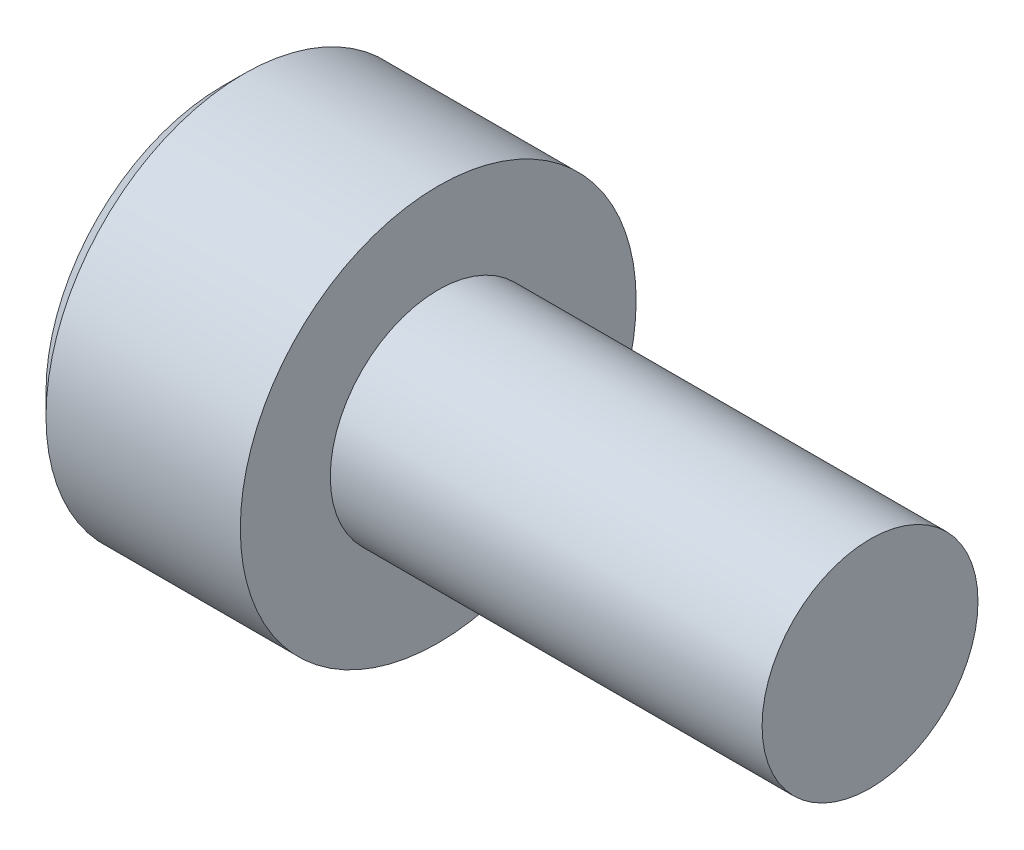
ISO-10303-21;
HEADER;
FILE_DESCRIPTION(('STEP AP214'),'2;1');
FILE_NAME('part.step','',(''),(''),'','','');
FILE_SCHEMA(('AUTOMOTIVE_DESIGN { 1 0 10303 214 1 1 1 1 }'));
ENDSEC;
DATA;
#1=APPLICATION_CONTEXT('core data for automotive mechanical design processes');
#2=APPLICATION_PROTOCOL_DEFINITION('international standard','automotive_design',2000,#1);
#3=PRODUCT_CONTEXT('',#1,'mechanical');
#4=PRODUCT('Part','Part','',(#3));
#5=PRODUCT_RELATED_PRODUCT_CATEGORY('part','',(#4));
#6=PRODUCT_DEFINITION_FORMATION('','',#4);
#7=PRODUCT_DEFINITION_CONTEXT('part definition',#1,'design');
#8=PRODUCT_DEFINITION('design','',#6,#7);
#9=PRODUCT_DEFINITION_SHAPE('','',#8);
#10=(LENGTH_UNIT() NAMED_UNIT(*) SI_UNIT(.MILLI.,.METRE.));
#11=(NAMED_UNIT(*) PLANE_ANGLE_UNIT() SI_UNIT($,.RADIAN.));
#12=(NAMED_UNIT(*) SI_UNIT($,.STERADIAN.) SOLID_ANGLE_UNIT());
#13=UNCERTAINTY_MEASURE_WITH_UNIT(LENGTH_MEASURE(1.E-05),#10,'distance_accuracy_value','');
#14=(GEOMETRIC_REPRESENTATION_CONTEXT(3) GLOBAL_UNCERTAINTY_ASSIGNED_CONTEXT((#13)) GLOBAL_UNIT_ASSIGNED_CONTEXT((#10,
#11,#12)) REPRESENTATION_CONTEXT('',''));
#15=CARTESIAN_POINT('',(0.,0.,0.));
#16=DIRECTION('',(0.,0.,1.));
#17=DIRECTION('',(1.,0.,0.));
#18=AXIS2_PLACEMENT_3D('',#15,#16,#17);
#19=CARTESIAN_POINT('',(-3.,0.,0.));
#20=DIRECTION('',(1.,0.,0.));
#21=DIRECTION('',(0.,1.,0.));
#22=AXIS2_PLACEMENT_3D('',#19,#20,#21);
#23=PLANE('',#22);
#24=CARTESIAN_POINT('',(-3.,0.,0.));
#25=DIRECTION('',(1.,0.,0.));
#26=DIRECTION('',(0.,1.,0.));
#27=AXIS2_PLACEMENT_3D('',#24,#25,#26);
#28=CIRCLE('',#27,2.45);
#29=CARTESIAN_POINT('',(-3.,2.45,0.));
#30=VERTEX_POINT('',#29);
#31=EDGE_CURVE('E44',#30,#30,#28,.F.);
#32=ORIENTED_EDGE('',*,*,#31,.T.);
#33=EDGE_LOOP('',(#32));
#34=FACE_BOUND('',#33,.T.);
#35=DIRECTION('',(0.,0.5,-0.866025403784439));
#36=VECTOR('',#35,1.);
#37=CARTESIAN_POINT('',(-3.,0.721687836487032,1.25));
#38=LINE('',#37,#36);
#39=CARTESIAN_POINT('',(-3.,0.721687836487031,1.25));
#40=VERTEX_POINT('',#39);
#41=CARTESIAN_POINT('',(-3.,1.44337567297406,0.));
#42=VERTEX_POINT('',#41);
#43=EDGE_CURVE('E149',#40,#42,#38,.T.);
#44=ORIENTED_EDGE('',*,*,#43,.F.);
#45=DIRECTION('',(0.,1.,0.));
#46=VECTOR('',#45,1.);
#47=CARTESIAN_POINT('',(-3.,-0.721687836487034,1.25));
#48=LINE('',#47,#46);
#49=CARTESIAN_POINT('',(-3.,-0.721687836487034,1.25));
#50=VERTEX_POINT('',#49);
#51=EDGE_CURVE('E122',#50,#40,#48,.T.);
#52=ORIENTED_EDGE('',*,*,#51,.F.);
#53=DIRECTION('',(0.,0.5,0.866025403784439));
#54=VECTOR('',#53,1.);
#55=CARTESIAN_POINT('',(-3.,-1.44337567297407,0.));
#56=LINE('',#55,#54);
#57=CARTESIAN_POINT('',(-3.,-1.44337567297407,0.));
#58=VERTEX_POINT('',#57);
#59=EDGE_CURVE('E118',#58,#50,#56,.T.);
#60=ORIENTED_EDGE('',*,*,#59,.F.);
#61=DIRECTION('',(0.,-0.5,0.866025403784439));
#62=VECTOR('',#61,1.);
#63=CARTESIAN_POINT('',(-3.,-0.721687836487033,-1.25));
#64=LINE('',#63,#62);
#65=CARTESIAN_POINT('',(-3.,-0.721687836487033,-1.25));
#66=VERTEX_POINT('',#65);
#67=EDGE_CURVE('E155',#66,#58,#64,.T.);
#68=ORIENTED_EDGE('',*,*,#67,.F.);
#69=DIRECTION('',(0.,-1.,0.));
#70=VECTOR('',#69,1.);
#71=CARTESIAN_POINT('',(-3.,0.721687836487032,-1.25));
#72=LINE('',#71,#70);
#73=CARTESIAN_POINT('',(-3.,0.721687836487032,-1.25));
#74=VERTEX_POINT('',#73);
#75=EDGE_CURVE('E153',#74,#66,#72,.T.);
#76=ORIENTED_EDGE('',*,*,#75,.F.);
#77=DIRECTION('',(0.,-0.5,-0.866025403784439));
#78=VECTOR('',#77,1.);
#79=CARTESIAN_POINT('',(-3.,1.44337567297406,0.));
#80=LINE('',#79,#78);
#81=EDGE_CURVE('E151',#42,#74,#80,.T.);
#82=ORIENTED_EDGE('',*,*,#81,.F.);
#83=EDGE_LOOP('',(#44,#52,#60,#68,#76,#82));
#84=FACE_BOUND('',#83,.T.);
#85=ADVANCED_FACE('F36',(#34,#84),#23,.F.);
#86=CARTESIAN_POINT('',(0.,1.5,0.));
#87=DIRECTION('',(-1.,0.,0.));
#88=DIRECTION('',(0.,-1.,0.));
#89=AXIS2_PLACEMENT_3D('',#86,#87,#88);
#90=PLANE('',#89);
#91=CARTESIAN_POINT('',(0.,0.,0.));
#92=DIRECTION('',(-1.,0.,0.));
#93=DIRECTION('',(0.,-1.,0.));
#94=AXIS2_PLACEMENT_3D('',#91,#92,#93);
#95=CIRCLE('',#94,2.75);
#96=CARTESIAN_POINT('',(0.,-2.75,0.));
#97=VERTEX_POINT('',#96);
#98=EDGE_CURVE('E181',#97,#97,#95,.T.);
#99=ORIENTED_EDGE('',*,*,#98,.F.);
#100=EDGE_LOOP('',(#99));
#101=FACE_BOUND('',#100,.T.);
#102=CARTESIAN_POINT('',(0.,0.,0.));
#103=DIRECTION('',(-1.,0.,0.));
#104=DIRECTION('',(0.,-1.,0.));
#105=AXIS2_PLACEMENT_3D('',#102,#103,#104);
#106=CIRCLE('',#105,1.5);
#107=CARTESIAN_POINT('',(0.,-1.5,0.));
#108=VERTEX_POINT('',#107);
#109=EDGE_CURVE('E175',#108,#108,#106,.T.);
#110=ORIENTED_EDGE('',*,*,#109,.T.);
#111=EDGE_LOOP('',(#110));
#112=FACE_BOUND('',#111,.T.);
#113=ADVANCED_FACE('F199',(#101,#112),#90,.F.);
#114=CARTESIAN_POINT('',(-3.,0.,0.));
#115=DIRECTION('',(-1.,0.,0.));
#116=DIRECTION('',(0.,-1.,0.));
#117=AXIS2_PLACEMENT_3D('',#114,#115,#116);
#118=CYLINDRICAL_SURFACE('',#117,2.75);
#119=CARTESIAN_POINT('',(-2.7,0.,0.));
#120=DIRECTION('',(1.,0.,0.));
#121=DIRECTION('',(0.,1.,0.));
#122=AXIS2_PLACEMENT_3D('',#119,#120,#121);
#123=CIRCLE('',#122,2.75);
#124=CARTESIAN_POINT('',(-2.7,2.75,0.));
#125=VERTEX_POINT('',#124);
#126=EDGE_CURVE('E11',#125,#125,#123,.T.);
#127=ORIENTED_EDGE('',*,*,#126,.T.);
#128=EDGE_LOOP('',(#127));
#129=FACE_BOUND('',#128,.T.);
#130=ORIENTED_EDGE('',*,*,#98,.T.);
#131=EDGE_LOOP('',(#130));
#132=FACE_BOUND('',#131,.T.);
#133=ADVANCED_FACE('F204',(#129,#132),#118,.T.);
#134=CARTESIAN_POINT('',(6.,1.5,0.));
#135=DIRECTION('',(-1.,0.,0.));
#136=DIRECTION('',(0.,-1.,0.));
#137=AXIS2_PLACEMENT_3D('',#134,#135,#136);
#138=PLANE('',#137);
#139=CARTESIAN_POINT('',(6.,0.,0.));
#140=DIRECTION('',(-1.,0.,0.));
#141=DIRECTION('',(0.,-1.,0.));
#142=AXIS2_PLACEMENT_3D('',#139,#140,#141);
#143=CIRCLE('',#142,1.5);
#144=CARTESIAN_POINT('',(6.,-1.5,0.));
#145=VERTEX_POINT('',#144);
#146=EDGE_CURVE('E178',#145,#145,#143,.T.);
#147=ORIENTED_EDGE('',*,*,#146,.F.);
#148=EDGE_LOOP('',(#147));
#149=FACE_BOUND('',#148,.T.);
#150=ADVANCED_FACE('F208',(#149),#138,.F.);
#151=CARTESIAN_POINT('',(-3.,0.,0.));
#152=DIRECTION('',(-1.,0.,0.));
#153=DIRECTION('',(0.,-1.,0.));
#154=AXIS2_PLACEMENT_3D('',#151,#152,#153);
#155=CYLINDRICAL_SURFACE('',#154,1.5);
#156=ORIENTED_EDGE('',*,*,#109,.F.);
#157=EDGE_LOOP('',(#156));
#158=FACE_BOUND('',#157,.T.);
#159=ORIENTED_EDGE('',*,*,#146,.T.);
#160=EDGE_LOOP('',(#159));
#161=FACE_BOUND('',#160,.T.);
#162=ADVANCED_FACE('F215',(#158,#161),#155,.T.);
#163=CARTESIAN_POINT('',(-1.7,-0.721687836487034,1.25));
#164=DIRECTION('',(0.,0.,1.));
#165=DIRECTION('',(0.,-1.,0.));
#166=AXIS2_PLACEMENT_3D('',#163,#164,#165);
#167=PLANE('',#166);
#168=DIRECTION('',(0.,1.,0.));
#169=VECTOR('',#168,1.);
#170=CARTESIAN_POINT('',(-1.7,-0.721687836487034,1.25));
#171=LINE('',#170,#169);
#172=CARTESIAN_POINT('',(-1.7,-0.721687836487034,1.25));
#173=VERTEX_POINT('',#172);
#174=CARTESIAN_POINT('',(-1.7,0.,1.25));
#175=VERTEX_POINT('',#174);
#176=EDGE_CURVE('E59',#173,#175,#171,.T.);
#177=ORIENTED_EDGE('',*,*,#176,.F.);
#178=DIRECTION('',(-1.,0.,0.));
#179=VECTOR('',#178,1.);
#180=CARTESIAN_POINT('',(-1.7,-0.721687836487034,1.25));
#181=LINE('',#180,#179);
#182=EDGE_CURVE('E159',#173,#50,#181,.T.);
#183=ORIENTED_EDGE('',*,*,#182,.T.);
#184=ORIENTED_EDGE('',*,*,#51,.T.);
#185=DIRECTION('',(-1.,0.,0.));
#186=VECTOR('',#185,1.);
#187=CARTESIAN_POINT('',(-1.7,0.721687836487032,1.25));
#188=LINE('',#187,#186);
#189=CARTESIAN_POINT('',(-1.7,0.721687836487032,1.25));
#190=VERTEX_POINT('',#189);
#191=EDGE_CURVE('E51',#190,#40,#188,.T.);
#192=ORIENTED_EDGE('',*,*,#191,.F.);
#193=EDGE_CURVE('E111',#175,#190,#171,.T.);
#194=ORIENTED_EDGE('',*,*,#193,.F.);
#195=EDGE_LOOP('',(#177,#183,#184,#192,#194));
#196=FACE_BOUND('',#195,.T.);
#197=ADVANCED_FACE('F120',(#196),#167,.F.);
#198=CARTESIAN_POINT('',(-1.7,-1.44337567297407,0.));
#199=DIRECTION('',(0.,-0.866025403784439,0.5));
#200=DIRECTION('',(0.,-0.5,-0.866025403784439));
#201=AXIS2_PLACEMENT_3D('',#198,#199,#200);
#202=PLANE('',#201);
#203=DIRECTION('',(0.,0.5,0.866025403784439));
#204=VECTOR('',#203,1.);
#205=CARTESIAN_POINT('',(-1.7,-1.44337567297407,0.));
#206=LINE('',#205,#204);
#207=CARTESIAN_POINT('',(-1.7,-1.44337567297407,0.));
#208=VERTEX_POINT('',#207);
#209=CARTESIAN_POINT('',(-1.7,-1.08253175473055,0.625000000000001));
#210=VERTEX_POINT('',#209);
#211=EDGE_CURVE('E125',#208,#210,#206,.T.);
#212=ORIENTED_EDGE('',*,*,#211,.F.);
#213=DIRECTION('',(-1.,0.,0.));
#214=VECTOR('',#213,1.);
#215=CARTESIAN_POINT('',(-1.7,-1.44337567297407,0.));
#216=LINE('',#215,#214);
#217=EDGE_CURVE('E162',#208,#58,#216,.T.);
#218=ORIENTED_EDGE('',*,*,#217,.T.);
#219=ORIENTED_EDGE('',*,*,#59,.T.);
#220=ORIENTED_EDGE('',*,*,#182,.F.);
#221=EDGE_CURVE('E145',#210,#173,#206,.T.);
#222=ORIENTED_EDGE('',*,*,#221,.F.);
#223=EDGE_LOOP('',(#212,#218,#219,#220,#222));
#224=FACE_BOUND('',#223,.T.);
#225=ADVANCED_FACE('F228',(#224),#202,.F.);
#226=CARTESIAN_POINT('',(-1.7,-0.721687836487033,-1.25));
#227=DIRECTION('',(0.,-0.866025403784439,-0.5));
#228=DIRECTION('',(0.,0.5,-0.866025403784439));
#229=AXIS2_PLACEMENT_3D('',#226,#227,#228);
#230=PLANE('',#229);
#231=DIRECTION('',(0.,-0.5,0.866025403784439));
#232=VECTOR('',#231,1.);
#233=CARTESIAN_POINT('',(-1.7,-0.721687836487033,-1.25));
#234=LINE('',#233,#232);
#235=CARTESIAN_POINT('',(-1.7,-0.721687836487033,-1.25));
#236=VERTEX_POINT('',#235);
#237=CARTESIAN_POINT('',(-1.7,-1.08253175473055,-0.625));
#238=VERTEX_POINT('',#237);
#239=EDGE_CURVE('E142',#236,#238,#234,.T.);
#240=ORIENTED_EDGE('',*,*,#239,.F.);
#241=DIRECTION('',(-1.,0.,0.));
#242=VECTOR('',#241,1.);
#243=CARTESIAN_POINT('',(-1.7,-0.721687836487033,-1.25));
#244=LINE('',#243,#242);
#245=EDGE_CURVE('E165',#236,#66,#244,.T.);
#246=ORIENTED_EDGE('',*,*,#245,.T.);
#247=ORIENTED_EDGE('',*,*,#67,.T.);
#248=ORIENTED_EDGE('',*,*,#217,.F.);
#249=EDGE_CURVE('E141',#238,#208,#234,.T.);
#250=ORIENTED_EDGE('',*,*,#249,.F.);
#251=EDGE_LOOP('',(#240,#246,#247,#248,#250));
#252=FACE_BOUND('',#251,.T.);
#253=ADVANCED_FACE('F240',(#252),#230,.F.);
#254=CARTESIAN_POINT('',(-1.7,0.721687836487032,-1.25));
#255=DIRECTION('',(0.,0.,-1.));
#256=DIRECTION('',(-1.,0.,0.));
#257=AXIS2_PLACEMENT_3D('',#254,#255,#256);
#258=PLANE('',#257);
#259=DIRECTION('',(0.,-1.,0.));
#260=VECTOR('',#259,1.);
#261=CARTESIAN_POINT('',(-1.7,0.721687836487032,-1.25));
#262=LINE('',#261,#260);
#263=CARTESIAN_POINT('',(-1.7,0.721687836487032,-1.25));
#264=VERTEX_POINT('',#263);
#265=CARTESIAN_POINT('',(-1.7,0.,-1.25));
#266=VERTEX_POINT('',#265);
#267=EDGE_CURVE('E138',#264,#266,#262,.T.);
#268=ORIENTED_EDGE('',*,*,#267,.F.);
#269=DIRECTION('',(-1.,0.,0.));
#270=VECTOR('',#269,1.);
#271=CARTESIAN_POINT('',(-1.7,0.721687836487032,-1.25));
#272=LINE('',#271,#270);
#273=EDGE_CURVE('E168',#264,#74,#272,.T.);
#274=ORIENTED_EDGE('',*,*,#273,.T.);
#275=ORIENTED_EDGE('',*,*,#75,.T.);
#276=ORIENTED_EDGE('',*,*,#245,.F.);
#277=EDGE_CURVE('E137',#266,#236,#262,.T.);
#278=ORIENTED_EDGE('',*,*,#277,.F.);
#279=EDGE_LOOP('',(#268,#274,#275,#276,#278));
#280=FACE_BOUND('',#279,.T.);
#281=ADVANCED_FACE('F236',(#280),#258,.F.);
#282=CARTESIAN_POINT('',(-1.7,1.44337567297406,0.));
#283=DIRECTION('',(0.,0.866025403784439,-0.5));
#284=DIRECTION('',(0.,0.5,0.866025403784439));
#285=AXIS2_PLACEMENT_3D('',#282,#283,#284);
#286=PLANE('',#285);
#287=DIRECTION('',(0.,-0.5,-0.866025403784439));
#288=VECTOR('',#287,1.);
#289=CARTESIAN_POINT('',(-1.7,1.44337567297406,0.));
#290=LINE('',#289,#288);
#291=CARTESIAN_POINT('',(-1.7,1.44337567297406,0.));
#292=VERTEX_POINT('',#291);
#293=CARTESIAN_POINT('',(-1.7,1.08253175473055,-0.625));
#294=VERTEX_POINT('',#293);
#295=EDGE_CURVE('E133',#292,#294,#290,.T.);
#296=ORIENTED_EDGE('',*,*,#295,.F.);
#297=DIRECTION('',(-1.,0.,0.));
#298=VECTOR('',#297,1.);
#299=CARTESIAN_POINT('',(-1.7,1.44337567297406,0.));
#300=LINE('',#299,#298);
#301=EDGE_CURVE('E124',#292,#42,#300,.T.);
#302=ORIENTED_EDGE('',*,*,#301,.T.);
#303=ORIENTED_EDGE('',*,*,#81,.T.);
#304=ORIENTED_EDGE('',*,*,#273,.F.);
#305=EDGE_CURVE('E131',#294,#264,#290,.T.);
#306=ORIENTED_EDGE('',*,*,#305,.F.);
#307=EDGE_LOOP('',(#296,#302,#303,#304,#306));
#308=FACE_BOUND('',#307,.T.);
#309=ADVANCED_FACE('F233',(#308),#286,.F.);
#310=CARTESIAN_POINT('',(-1.7,0.721687836487032,1.25));
#311=DIRECTION('',(0.,0.866025403784439,0.5));
#312=DIRECTION('',(0.,-0.5,0.866025403784439));
#313=AXIS2_PLACEMENT_3D('',#310,#311,#312);
#314=PLANE('',#313);
#315=DIRECTION('',(0.,0.5,-0.866025403784439));
#316=VECTOR('',#315,1.);
#317=CARTESIAN_POINT('',(-1.7,0.721687836487032,1.25));
#318=LINE('',#317,#316);
#319=CARTESIAN_POINT('',(-1.7,1.08253175473055,0.625));
#320=VERTEX_POINT('',#319);
#321=EDGE_CURVE('E113',#190,#320,#318,.T.);
#322=ORIENTED_EDGE('',*,*,#321,.F.);
#323=ORIENTED_EDGE('',*,*,#191,.T.);
#324=ORIENTED_EDGE('',*,*,#43,.T.);
#325=ORIENTED_EDGE('',*,*,#301,.F.);
#326=EDGE_CURVE('E130',#320,#292,#318,.T.);
#327=ORIENTED_EDGE('',*,*,#326,.F.);
#328=EDGE_LOOP('',(#322,#323,#324,#325,#327));
#329=FACE_BOUND('',#328,.T.);
#330=ADVANCED_FACE('F128',(#329),#314,.F.);
#331=CARTESIAN_POINT('',(-1.7,0.,0.));
#332=DIRECTION('',(-1.,0.,0.));
#333=DIRECTION('',(0.,0.,1.));
#334=AXIS2_PLACEMENT_3D('',#331,#332,#333);
#335=PLANE('',#334);
#336=ORIENTED_EDGE('',*,*,#193,.T.);
#337=ORIENTED_EDGE('',*,*,#321,.T.);
#338=CARTESIAN_POINT('',(-1.7,0.,0.));
#339=DIRECTION('',(-1.,0.,0.));
#340=DIRECTION('',(0.,-1.,0.));
#341=AXIS2_PLACEMENT_3D('',#338,#339,#340);
#342=CIRCLE('',#341,1.25);
#343=EDGE_CURVE('E115',#175,#320,#342,.T.);
#344=ORIENTED_EDGE('',*,*,#343,.F.);
#345=EDGE_LOOP('',(#336,#337,#344));
#346=FACE_BOUND('',#345,.T.);
#347=ADVANCED_FACE('F112',(#346),#335,.T.);
#348=ORIENTED_EDGE('',*,*,#326,.T.);
#349=ORIENTED_EDGE('',*,*,#295,.T.);
#350=EDGE_CURVE('E268',#320,#294,#342,.T.);
#351=ORIENTED_EDGE('',*,*,#350,.F.);
#352=EDGE_LOOP('',(#348,#349,#351));
#353=FACE_BOUND('',#352,.T.);
#354=ADVANCED_FACE('F256',(#353),#335,.T.);
#355=ORIENTED_EDGE('',*,*,#305,.T.);
#356=ORIENTED_EDGE('',*,*,#267,.T.);
#357=EDGE_CURVE('E274',#294,#266,#342,.T.);
#358=ORIENTED_EDGE('',*,*,#357,.F.);
#359=EDGE_LOOP('',(#355,#356,#358));
#360=FACE_BOUND('',#359,.T.);
#361=ADVANCED_FACE('F260',(#360),#335,.T.);
#362=ORIENTED_EDGE('',*,*,#277,.T.);
#363=ORIENTED_EDGE('',*,*,#239,.T.);
#364=EDGE_CURVE('E276',#266,#238,#342,.T.);
#365=ORIENTED_EDGE('',*,*,#364,.F.);
#366=EDGE_LOOP('',(#362,#363,#365));
#367=FACE_BOUND('',#366,.T.);
#368=ADVANCED_FACE('F253',(#367),#335,.T.);
#369=ORIENTED_EDGE('',*,*,#249,.T.);
#370=ORIENTED_EDGE('',*,*,#211,.T.);
#371=EDGE_CURVE('E161',#238,#210,#342,.T.);
#372=ORIENTED_EDGE('',*,*,#371,.F.);
#373=EDGE_LOOP('',(#369,#370,#372));
#374=FACE_BOUND('',#373,.T.);
#375=ADVANCED_FACE('F249',(#374),#335,.T.);
#376=ORIENTED_EDGE('',*,*,#221,.T.);
#377=ORIENTED_EDGE('',*,*,#176,.T.);
#378=EDGE_CURVE('E173',#210,#175,#342,.T.);
#379=ORIENTED_EDGE('',*,*,#378,.F.);
#380=EDGE_LOOP('',(#376,#377,#379));
#381=FACE_BOUND('',#380,.T.);
#382=ADVANCED_FACE('F194',(#381),#335,.T.);
#383=CARTESIAN_POINT('',(-0.948924226215541,0.,0.));
#384=DIRECTION('',(-1.,0.,0.));
#385=DIRECTION('',(0.,-1.,0.));
#386=AXIS2_PLACEMENT_3D('',#383,#384,#385);
#387=CONICAL_SURFACE('',#386,0.,1.02974425867665);
#388=ORIENTED_EDGE('',*,*,#378,.T.);
#389=ORIENTED_EDGE('',*,*,#343,.T.);
#390=ORIENTED_EDGE('',*,*,#350,.T.);
#391=ORIENTED_EDGE('',*,*,#357,.T.);
#392=ORIENTED_EDGE('',*,*,#364,.T.);
#393=ORIENTED_EDGE('',*,*,#371,.T.);
#394=EDGE_LOOP('',(#388,#389,#390,#391,#392,#393));
#395=FACE_BOUND('',#394,.T.);
#396=CARTESIAN_POINT('',(-0.948924226215541,0.,0.));
#397=VERTEX_POINT('',#396);
#398=VERTEX_LOOP('',#397);
#399=FACE_BOUND('',#398,.T.);
#400=ADVANCED_FACE('F189',(#395,#399),#387,.F.);
#401=CARTESIAN_POINT('',(-3.,0.,0.));
#402=DIRECTION('',(1.,0.,0.));
#403=DIRECTION('',(0.,1.,0.));
#404=AXIS2_PLACEMENT_3D('',#401,#402,#403);
#405=CONICAL_SURFACE('',#404,2.45,0.78539816339745);
#406=ORIENTED_EDGE('',*,*,#126,.F.);
#407=EDGE_LOOP('',(#406));
#408=FACE_BOUND('',#407,.T.);
#409=ORIENTED_EDGE('',*,*,#31,.F.);
#410=EDGE_LOOP('',(#409));
#411=FACE_BOUND('',#410,.T.);
#412=ADVANCED_FACE('F38',(#408,#411),#405,.T.);
#413=CLOSED_SHELL('',(#85,#113,#133,#150,#162,#197,#225,#253,#281,#309,#330,#347,#354,#361,#368,
#375,#382,#400,#412));
#414=MANIFOLD_SOLID_BREP('B2',#413);
#415=ADVANCED_BREP_SHAPE_REPRESENTATION('',(#18,#414),#14);
#416=SHAPE_DEFINITION_REPRESENTATION(#9,#415);
ENDSEC;
END-ISO-10303-21;
